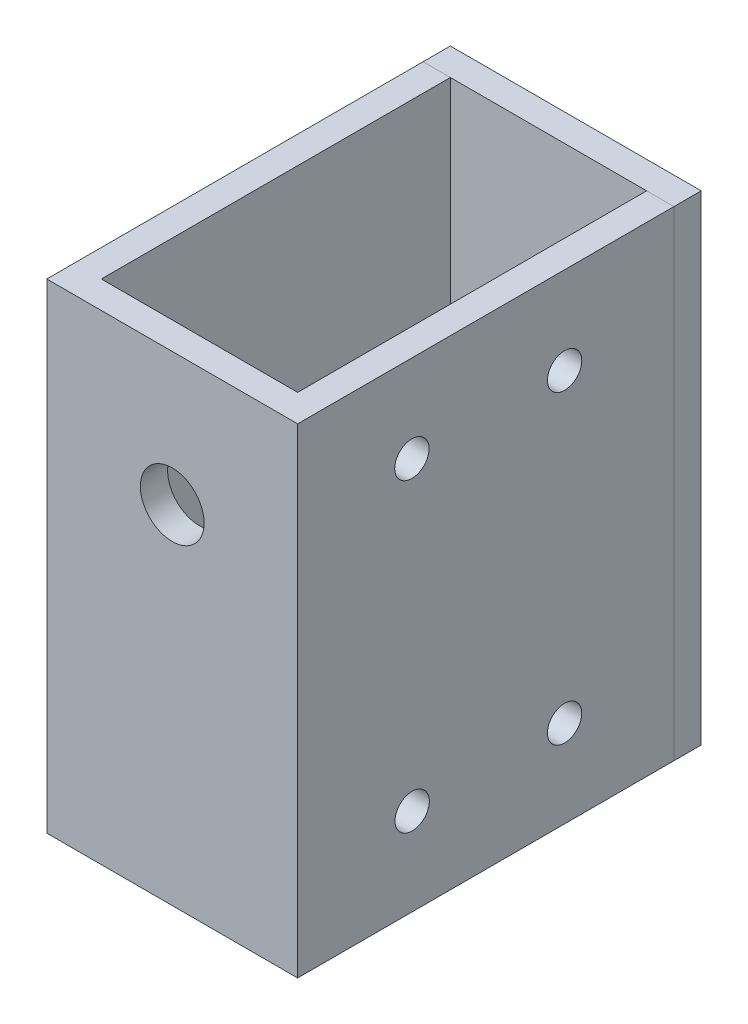
ISO-10303-21;
HEADER;
FILE_DESCRIPTION(('STEP AP214'),'2;1');
FILE_NAME('part.step','',(''),(''),'','','');
FILE_SCHEMA(('AUTOMOTIVE_DESIGN { 1 0 10303 214 1 1 1 1 }'));
ENDSEC;
DATA;
#1=APPLICATION_CONTEXT('core data for automotive mechanical design processes');
#2=APPLICATION_PROTOCOL_DEFINITION('international standard','automotive_design',2000,#1);
#3=PRODUCT_CONTEXT('',#1,'mechanical');
#4=PRODUCT('Part','Part','',(#3));
#5=PRODUCT_RELATED_PRODUCT_CATEGORY('part','',(#4));
#6=PRODUCT_DEFINITION_FORMATION('','',#4);
#7=PRODUCT_DEFINITION_CONTEXT('part definition',#1,'design');
#8=PRODUCT_DEFINITION('design','',#6,#7);
#9=PRODUCT_DEFINITION_SHAPE('','',#8);
#10=(LENGTH_UNIT() NAMED_UNIT(*) SI_UNIT(.MILLI.,.METRE.));
#11=(NAMED_UNIT(*) PLANE_ANGLE_UNIT() SI_UNIT($,.RADIAN.));
#12=(NAMED_UNIT(*) SI_UNIT($,.STERADIAN.) SOLID_ANGLE_UNIT());
#13=UNCERTAINTY_MEASURE_WITH_UNIT(LENGTH_MEASURE(1.E-05),#10,'distance_accuracy_value','');
#14=(GEOMETRIC_REPRESENTATION_CONTEXT(3) GLOBAL_UNCERTAINTY_ASSIGNED_CONTEXT((#13)) GLOBAL_UNIT_ASSIGNED_CONTEXT((#10,
#11,#12)) REPRESENTATION_CONTEXT('',''));
#15=CARTESIAN_POINT('',(0.,0.,0.));
#16=DIRECTION('',(0.,0.,1.));
#17=DIRECTION('',(1.,0.,0.));
#18=AXIS2_PLACEMENT_3D('',#15,#16,#17);
#19=CARTESIAN_POINT('',(0.,55.88,-3.175));
#20=DIRECTION('',(0.,-1.,0.));
#21=DIRECTION('',(0.,0.,-1.));
#22=AXIS2_PLACEMENT_3D('',#19,#20,#21);
#23=PLANE('',#22);
#24=DIRECTION('',(1.,0.,0.));
#25=VECTOR('',#24,1.);
#26=CARTESIAN_POINT('',(0.,55.88,0.));
#27=LINE('',#26,#25);
#28=CARTESIAN_POINT('',(0.,55.88,0.));
#29=VERTEX_POINT('',#28);
#30=CARTESIAN_POINT('',(29.21,55.88,0.));
#31=VERTEX_POINT('',#30);
#32=EDGE_CURVE('E114',#29,#31,#27,.T.);
#33=ORIENTED_EDGE('',*,*,#32,.T.);
#34=DIRECTION('',(0.,0.,1.));
#35=VECTOR('',#34,1.);
#36=CARTESIAN_POINT('',(29.21,55.88,-3.175));
#37=LINE('',#36,#35);
#38=CARTESIAN_POINT('',(29.21,55.88,-3.175));
#39=VERTEX_POINT('',#38);
#40=EDGE_CURVE('E12',#39,#31,#37,.T.);
#41=ORIENTED_EDGE('',*,*,#40,.F.);
#42=DIRECTION('',(1.,0.,0.));
#43=VECTOR('',#42,1.);
#44=CARTESIAN_POINT('',(0.,55.88,-3.175));
#45=LINE('',#44,#43);
#46=CARTESIAN_POINT('',(0.,55.88,-3.175));
#47=VERTEX_POINT('',#46);
#48=EDGE_CURVE('E102',#47,#39,#45,.T.);
#49=ORIENTED_EDGE('',*,*,#48,.F.);
#50=DIRECTION('',(0.,0.,1.));
#51=VECTOR('',#50,1.);
#52=CARTESIAN_POINT('',(0.,55.88,-3.175));
#53=LINE('',#52,#51);
#54=EDGE_CURVE('E110',#47,#29,#53,.T.);
#55=ORIENTED_EDGE('',*,*,#54,.T.);
#56=EDGE_LOOP('',(#33,#41,#49,#55));
#57=FACE_BOUND('',#56,.T.);
#58=ADVANCED_FACE('F51',(#57),#23,.F.);
#59=CARTESIAN_POINT('',(29.21,55.88,-3.175));
#60=DIRECTION('',(-1.,0.,0.));
#61=DIRECTION('',(0.,-1.,0.));
#62=AXIS2_PLACEMENT_3D('',#59,#60,#61);
#63=PLANE('',#62);
#64=DIRECTION('',(0.,-1.,0.));
#65=VECTOR('',#64,1.);
#66=CARTESIAN_POINT('',(29.21,55.88,0.));
#67=LINE('',#66,#65);
#68=CARTESIAN_POINT('',(29.21,0.,0.));
#69=VERTEX_POINT('',#68);
#70=EDGE_CURVE('E106',#31,#69,#67,.T.);
#71=ORIENTED_EDGE('',*,*,#70,.T.);
#72=DIRECTION('',(0.,0.,1.));
#73=VECTOR('',#72,1.);
#74=CARTESIAN_POINT('',(29.21,0.,-3.175));
#75=LINE('',#74,#73);
#76=CARTESIAN_POINT('',(29.21,0.,-3.175));
#77=VERTEX_POINT('',#76);
#78=EDGE_CURVE('E59',#77,#69,#75,.T.);
#79=ORIENTED_EDGE('',*,*,#78,.F.);
#80=DIRECTION('',(0.,-1.,0.));
#81=VECTOR('',#80,1.);
#82=CARTESIAN_POINT('',(29.21,55.88,-3.175));
#83=LINE('',#82,#81);
#84=EDGE_CURVE('E97',#39,#77,#83,.T.);
#85=ORIENTED_EDGE('',*,*,#84,.F.);
#86=ORIENTED_EDGE('',*,*,#40,.T.);
#87=EDGE_LOOP('',(#71,#79,#85,#86));
#88=FACE_BOUND('',#87,.T.);
#89=ADVANCED_FACE('F105',(#88),#63,.F.);
#90=CARTESIAN_POINT('',(29.21,0.,-3.175));
#91=DIRECTION('',(0.,1.,0.));
#92=DIRECTION('',(-1.,0.,0.));
#93=AXIS2_PLACEMENT_3D('',#90,#91,#92);
#94=PLANE('',#93);
#95=DIRECTION('',(-1.,0.,0.));
#96=VECTOR('',#95,1.);
#97=CARTESIAN_POINT('',(29.21,0.,0.));
#98=LINE('',#97,#96);
#99=CARTESIAN_POINT('',(0.,0.,0.));
#100=VERTEX_POINT('',#99);
#101=EDGE_CURVE('E84',#69,#100,#98,.T.);
#102=ORIENTED_EDGE('',*,*,#101,.T.);
#103=DIRECTION('',(0.,0.,1.));
#104=VECTOR('',#103,1.);
#105=CARTESIAN_POINT('',(0.,0.,-3.175));
#106=LINE('',#105,#104);
#107=CARTESIAN_POINT('',(0.,0.,-3.175));
#108=VERTEX_POINT('',#107);
#109=EDGE_CURVE('E107',#108,#100,#106,.T.);
#110=ORIENTED_EDGE('',*,*,#109,.F.);
#111=DIRECTION('',(-1.,0.,0.));
#112=VECTOR('',#111,1.);
#113=CARTESIAN_POINT('',(29.21,0.,-3.175));
#114=LINE('',#113,#112);
#115=EDGE_CURVE('E100',#77,#108,#114,.T.);
#116=ORIENTED_EDGE('',*,*,#115,.F.);
#117=ORIENTED_EDGE('',*,*,#78,.T.);
#118=EDGE_LOOP('',(#102,#110,#116,#117));
#119=FACE_BOUND('',#118,.T.);
#120=ADVANCED_FACE('F108',(#119),#94,.F.);
#121=CARTESIAN_POINT('',(0.,0.,-3.175));
#122=DIRECTION('',(1.,0.,0.));
#123=DIRECTION('',(0.,0.,-1.));
#124=AXIS2_PLACEMENT_3D('',#121,#122,#123);
#125=PLANE('',#124);
#126=DIRECTION('',(0.,1.,0.));
#127=VECTOR('',#126,1.);
#128=CARTESIAN_POINT('',(0.,0.,0.));
#129=LINE('',#128,#127);
#130=EDGE_CURVE('E90',#100,#29,#129,.T.);
#131=ORIENTED_EDGE('',*,*,#130,.T.);
#132=ORIENTED_EDGE('',*,*,#54,.F.);
#133=DIRECTION('',(0.,1.,0.));
#134=VECTOR('',#133,1.);
#135=CARTESIAN_POINT('',(0.,0.,-3.175));
#136=LINE('',#135,#134);
#137=EDGE_CURVE('E67',#108,#47,#136,.T.);
#138=ORIENTED_EDGE('',*,*,#137,.F.);
#139=ORIENTED_EDGE('',*,*,#109,.T.);
#140=EDGE_LOOP('',(#131,#132,#138,#139));
#141=FACE_BOUND('',#140,.T.);
#142=ADVANCED_FACE('F121',(#141),#125,.F.);
#143=CARTESIAN_POINT('',(0.,0.,-3.175));
#144=DIRECTION('',(0.,0.,-1.));
#145=DIRECTION('',(-1.,0.,0.));
#146=AXIS2_PLACEMENT_3D('',#143,#144,#145);
#147=PLANE('',#146);
#148=ORIENTED_EDGE('',*,*,#48,.T.);
#149=ORIENTED_EDGE('',*,*,#84,.T.);
#150=ORIENTED_EDGE('',*,*,#115,.T.);
#151=ORIENTED_EDGE('',*,*,#137,.T.);
#152=EDGE_LOOP('',(#148,#149,#150,#151));
#153=FACE_BOUND('',#152,.T.);
#154=ADVANCED_FACE('F98',(#153),#147,.T.);
#155=CARTESIAN_POINT('',(0.,0.,0.));
#156=DIRECTION('',(0.,0.,-1.));
#157=DIRECTION('',(-1.,0.,0.));
#158=AXIS2_PLACEMENT_3D('',#155,#156,#157);
#159=PLANE('',#158);
#160=ORIENTED_EDGE('',*,*,#32,.F.);
#161=ORIENTED_EDGE('',*,*,#130,.F.);
#162=ORIENTED_EDGE('',*,*,#101,.F.);
#163=ORIENTED_EDGE('',*,*,#70,.F.);
#164=EDGE_LOOP('',(#160,#161,#162,#163));
#165=FACE_BOUND('',#164,.T.);
#166=ADVANCED_FACE('F124',(#165),#159,.F.);
#167=CLOSED_SHELL('',(#58,#89,#120,#142,#154,#166));
#168=MANIFOLD_SOLID_BREP('B2',#167);
#169=CARTESIAN_POINT('',(29.21,0.,40.64));
#170=DIRECTION('',(0.,1.,0.));
#171=DIRECTION('',(-1.,0.,0.));
#172=AXIS2_PLACEMENT_3D('',#169,#170,#171);
#173=PLANE('',#172);
#174=DIRECTION('',(1.,0.,0.));
#175=VECTOR('',#174,1.);
#176=CARTESIAN_POINT('',(29.21,0.,0.));
#177=LINE('',#176,#175);
#178=CARTESIAN_POINT('',(0.,0.,0.));
#179=VERTEX_POINT('',#178);
#180=CARTESIAN_POINT('',(29.21,0.,0.));
#181=VERTEX_POINT('',#180);
#182=EDGE_CURVE('E278',#179,#181,#177,.T.);
#183=ORIENTED_EDGE('',*,*,#182,.T.);
#184=DIRECTION('',(0.,0.,-1.));
#185=VECTOR('',#184,1.);
#186=CARTESIAN_POINT('',(29.21,0.,40.64));
#187=LINE('',#186,#185);
#188=CARTESIAN_POINT('',(29.21,0.,43.815));
#189=VERTEX_POINT('',#188);
#190=EDGE_CURVE('E49',#189,#181,#187,.T.);
#191=ORIENTED_EDGE('',*,*,#190,.F.);
#192=DIRECTION('',(1.,0.,0.));
#193=VECTOR('',#192,1.);
#194=CARTESIAN_POINT('',(0.,0.,43.815));
#195=LINE('',#194,#193);
#196=CARTESIAN_POINT('',(0.,0.,43.815));
#197=VERTEX_POINT('',#196);
#198=EDGE_CURVE('E262',#197,#189,#195,.T.);
#199=ORIENTED_EDGE('',*,*,#198,.F.);
#200=DIRECTION('',(0.,0.,-1.));
#201=VECTOR('',#200,1.);
#202=CARTESIAN_POINT('',(0.,0.,40.64));
#203=LINE('',#202,#201);
#204=EDGE_CURVE('E254',#197,#179,#203,.T.);
#205=ORIENTED_EDGE('',*,*,#204,.T.);
#206=EDGE_LOOP('',(#183,#191,#199,#205));
#207=FACE_BOUND('',#206,.T.);
#208=ADVANCED_FACE('F175',(#207),#173,.F.);
#209=CARTESIAN_POINT('',(29.21,55.88,40.64));
#210=DIRECTION('',(-1.,0.,0.));
#211=DIRECTION('',(0.,-1.,0.));
#212=AXIS2_PLACEMENT_3D('',#209,#210,#211);
#213=PLANE('',#212);
#214=CARTESIAN_POINT('',(29.21,45.72,30.5127030555497));
#215=DIRECTION('',(1.,0.,0.));
#216=DIRECTION('',(0.,1.,0.));
#217=AXIS2_PLACEMENT_3D('',#214,#215,#216);
#218=CIRCLE('',#217,2.);
#219=CARTESIAN_POINT('',(29.21,47.72,30.5127030555497));
#220=VERTEX_POINT('',#219);
#221=EDGE_CURVE('E395',#220,#220,#218,.T.);
#222=ORIENTED_EDGE('',*,*,#221,.F.);
#223=EDGE_LOOP('',(#222));
#224=FACE_BOUND('',#223,.T.);
#225=CARTESIAN_POINT('',(29.21,10.16,30.48));
#226=DIRECTION('',(1.,0.,0.));
#227=DIRECTION('',(0.,1.,0.));
#228=AXIS2_PLACEMENT_3D('',#225,#226,#227);
#229=CIRCLE('',#228,2.);
#230=CARTESIAN_POINT('',(29.21,12.16,30.48));
#231=VERTEX_POINT('',#230);
#232=EDGE_CURVE('E387',#231,#231,#229,.T.);
#233=ORIENTED_EDGE('',*,*,#232,.F.);
#234=EDGE_LOOP('',(#233));
#235=FACE_BOUND('',#234,.T.);
#236=CARTESIAN_POINT('',(29.21,10.16,12.7327030555497));
#237=DIRECTION('',(1.,0.,0.));
#238=DIRECTION('',(0.,1.,0.));
#239=AXIS2_PLACEMENT_3D('',#236,#237,#238);
#240=CIRCLE('',#239,2.);
#241=CARTESIAN_POINT('',(29.21,12.16,12.7327030555497));
#242=VERTEX_POINT('',#241);
#243=EDGE_CURVE('E380',#242,#242,#240,.T.);
#244=ORIENTED_EDGE('',*,*,#243,.F.);
#245=EDGE_LOOP('',(#244));
#246=FACE_BOUND('',#245,.T.);
#247=CARTESIAN_POINT('',(29.21,45.72,12.7327030555497));
#248=DIRECTION('',(1.,0.,0.));
#249=DIRECTION('',(0.,1.,0.));
#250=AXIS2_PLACEMENT_3D('',#247,#248,#249);
#251=CIRCLE('',#250,2.);
#252=CARTESIAN_POINT('',(29.21,47.72,12.7327030555497));
#253=VERTEX_POINT('',#252);
#254=EDGE_CURVE('E382',#253,#253,#251,.T.);
#255=ORIENTED_EDGE('',*,*,#254,.F.);
#256=EDGE_LOOP('',(#255));
#257=FACE_BOUND('',#256,.T.);
#258=DIRECTION('',(0.,1.,0.));
#259=VECTOR('',#258,1.);
#260=CARTESIAN_POINT('',(29.21,55.88,0.));
#261=LINE('',#260,#259);
#262=CARTESIAN_POINT('',(29.21,55.88,0.));
#263=VERTEX_POINT('',#262);
#264=EDGE_CURVE('E291',#181,#263,#261,.T.);
#265=ORIENTED_EDGE('',*,*,#264,.T.);
#266=DIRECTION('',(0.,0.,-1.));
#267=VECTOR('',#266,1.);
#268=CARTESIAN_POINT('',(29.21,55.88,40.64));
#269=LINE('',#268,#267);
#270=CARTESIAN_POINT('',(29.21,55.88,43.815));
#271=VERTEX_POINT('',#270);
#272=EDGE_CURVE('E183',#271,#263,#269,.T.);
#273=ORIENTED_EDGE('',*,*,#272,.F.);
#274=DIRECTION('',(0.,1.,0.));
#275=VECTOR('',#274,1.);
#276=CARTESIAN_POINT('',(29.21,0.,43.815));
#277=LINE('',#276,#275);
#278=EDGE_CURVE('E268',#189,#271,#277,.T.);
#279=ORIENTED_EDGE('',*,*,#278,.F.);
#280=ORIENTED_EDGE('',*,*,#190,.T.);
#281=EDGE_LOOP('',(#265,#273,#279,#280));
#282=FACE_BOUND('',#281,.T.);
#283=ADVANCED_FACE('F325',(#224,#235,#246,#257,#282),#213,.F.);
#284=CARTESIAN_POINT('',(26.035,3.175,40.64));
#285=DIRECTION('',(1.,0.,0.));
#286=DIRECTION('',(0.,0.,-1.));
#287=AXIS2_PLACEMENT_3D('',#284,#285,#286);
#288=PLANE('',#287);
#289=CARTESIAN_POINT('',(26.035,45.72,30.5127030555497));
#290=DIRECTION('',(1.,0.,0.));
#291=DIRECTION('',(0.,1.,0.));
#292=AXIS2_PLACEMENT_3D('',#289,#290,#291);
#293=CIRCLE('',#292,2.);
#294=CARTESIAN_POINT('',(26.035,47.72,30.5127030555497));
#295=VERTEX_POINT('',#294);
#296=EDGE_CURVE('E398',#295,#295,#293,.T.);
#297=ORIENTED_EDGE('',*,*,#296,.T.);
#298=EDGE_LOOP('',(#297));
#299=FACE_BOUND('',#298,.T.);
#300=CARTESIAN_POINT('',(26.035,10.16,30.48));
#301=DIRECTION('',(1.,0.,0.));
#302=DIRECTION('',(0.,1.,0.));
#303=AXIS2_PLACEMENT_3D('',#300,#301,#302);
#304=CIRCLE('',#303,2.);
#305=CARTESIAN_POINT('',(26.035,12.16,30.48));
#306=VERTEX_POINT('',#305);
#307=EDGE_CURVE('E392',#306,#306,#304,.T.);
#308=ORIENTED_EDGE('',*,*,#307,.T.);
#309=EDGE_LOOP('',(#308));
#310=FACE_BOUND('',#309,.T.);
#311=CARTESIAN_POINT('',(26.035,10.16,12.7327030555497));
#312=DIRECTION('',(1.,0.,0.));
#313=DIRECTION('',(0.,1.,0.));
#314=AXIS2_PLACEMENT_3D('',#311,#312,#313);
#315=CIRCLE('',#314,2.);
#316=CARTESIAN_POINT('',(26.035,12.16,12.7327030555497));
#317=VERTEX_POINT('',#316);
#318=EDGE_CURVE('E377',#317,#317,#315,.T.);
#319=ORIENTED_EDGE('',*,*,#318,.T.);
#320=EDGE_LOOP('',(#319));
#321=FACE_BOUND('',#320,.T.);
#322=CARTESIAN_POINT('',(26.035,45.72,12.7327030555497));
#323=DIRECTION('',(1.,0.,0.));
#324=DIRECTION('',(0.,1.,0.));
#325=AXIS2_PLACEMENT_3D('',#322,#323,#324);
#326=CIRCLE('',#325,2.);
#327=CARTESIAN_POINT('',(26.035,47.72,12.7327030555497));
#328=VERTEX_POINT('',#327);
#329=EDGE_CURVE('E385',#328,#328,#326,.T.);
#330=ORIENTED_EDGE('',*,*,#329,.T.);
#331=EDGE_LOOP('',(#330));
#332=FACE_BOUND('',#331,.T.);
#333=DIRECTION('',(0.,-1.,0.));
#334=VECTOR('',#333,1.);
#335=CARTESIAN_POINT('',(26.035,3.175,0.));
#336=LINE('',#335,#334);
#337=CARTESIAN_POINT('',(26.035,55.88,0.));
#338=VERTEX_POINT('',#337);
#339=CARTESIAN_POINT('',(26.035,3.175,0.));
#340=VERTEX_POINT('',#339);
#341=EDGE_CURVE('E295',#338,#340,#336,.T.);
#342=ORIENTED_EDGE('',*,*,#341,.T.);
#343=DIRECTION('',(0.,0.,-1.));
#344=VECTOR('',#343,1.);
#345=CARTESIAN_POINT('',(26.035,3.175,40.64));
#346=LINE('',#345,#344);
#347=CARTESIAN_POINT('',(26.035,3.175,40.64));
#348=VERTEX_POINT('',#347);
#349=EDGE_CURVE('E306',#348,#340,#346,.T.);
#350=ORIENTED_EDGE('',*,*,#349,.F.);
#351=DIRECTION('',(0.,-1.,0.));
#352=VECTOR('',#351,1.);
#353=CARTESIAN_POINT('',(26.035,3.175,40.64));
#354=LINE('',#353,#352);
#355=CARTESIAN_POINT('',(26.035,55.88,40.64));
#356=VERTEX_POINT('',#355);
#357=EDGE_CURVE('E280',#356,#348,#354,.T.);
#358=ORIENTED_EDGE('',*,*,#357,.F.);
#359=DIRECTION('',(0.,0.,-1.));
#360=VECTOR('',#359,1.);
#361=CARTESIAN_POINT('',(26.035,55.88,40.64));
#362=LINE('',#361,#360);
#363=EDGE_CURVE('E232',#356,#338,#362,.T.);
#364=ORIENTED_EDGE('',*,*,#363,.T.);
#365=EDGE_LOOP('',(#342,#350,#358,#364));
#366=FACE_BOUND('',#365,.T.);
#367=ADVANCED_FACE('F318',(#299,#310,#321,#332,#366),#288,.F.);
#368=CARTESIAN_POINT('',(3.17500000000001,3.175,40.64));
#369=DIRECTION('',(0.,-1.,0.));
#370=DIRECTION('',(0.,0.,-1.));
#371=AXIS2_PLACEMENT_3D('',#368,#369,#370);
#372=PLANE('',#371);
#373=DIRECTION('',(-1.,0.,0.));
#374=VECTOR('',#373,1.);
#375=CARTESIAN_POINT('',(3.17500000000001,3.175,0.));
#376=LINE('',#375,#374);
#377=CARTESIAN_POINT('',(3.17500000000001,3.175,0.));
#378=VERTEX_POINT('',#377);
#379=EDGE_CURVE('E297',#340,#378,#376,.T.);
#380=ORIENTED_EDGE('',*,*,#379,.T.);
#381=DIRECTION('',(0.,0.,-1.));
#382=VECTOR('',#381,1.);
#383=CARTESIAN_POINT('',(3.17500000000001,3.175,40.64));
#384=LINE('',#383,#382);
#385=CARTESIAN_POINT('',(3.17500000000001,3.175,40.64));
#386=VERTEX_POINT('',#385);
#387=EDGE_CURVE('E191',#386,#378,#384,.T.);
#388=ORIENTED_EDGE('',*,*,#387,.F.);
#389=DIRECTION('',(-1.,0.,0.));
#390=VECTOR('',#389,1.);
#391=CARTESIAN_POINT('',(3.17500000000001,3.175,40.64));
#392=LINE('',#391,#390);
#393=EDGE_CURVE('E283',#348,#386,#392,.T.);
#394=ORIENTED_EDGE('',*,*,#393,.F.);
#395=ORIENTED_EDGE('',*,*,#349,.T.);
#396=EDGE_LOOP('',(#380,#388,#394,#395));
#397=FACE_BOUND('',#396,.T.);
#398=ADVANCED_FACE('F319',(#397),#372,.F.);
#399=CARTESIAN_POINT('',(3.175,55.88,40.64));
#400=DIRECTION('',(-1.,0.,0.));
#401=DIRECTION('',(0.,-1.,0.));
#402=AXIS2_PLACEMENT_3D('',#399,#400,#401);
#403=PLANE('',#402);
#404=DIRECTION('',(0.,1.,0.));
#405=VECTOR('',#404,1.);
#406=CARTESIAN_POINT('',(3.175,55.88,0.));
#407=LINE('',#406,#405);
#408=CARTESIAN_POINT('',(3.175,55.88,0.));
#409=VERTEX_POINT('',#408);
#410=EDGE_CURVE('E299',#378,#409,#407,.T.);
#411=ORIENTED_EDGE('',*,*,#410,.T.);
#412=DIRECTION('',(0.,0.,-1.));
#413=VECTOR('',#412,1.);
#414=CARTESIAN_POINT('',(3.175,55.88,40.64));
#415=LINE('',#414,#413);
#416=CARTESIAN_POINT('',(3.175,55.88,40.64));
#417=VERTEX_POINT('',#416);
#418=EDGE_CURVE('E253',#417,#409,#415,.T.);
#419=ORIENTED_EDGE('',*,*,#418,.F.);
#420=DIRECTION('',(0.,1.,0.));
#421=VECTOR('',#420,1.);
#422=CARTESIAN_POINT('',(3.175,55.88,40.64));
#423=LINE('',#422,#421);
#424=EDGE_CURVE('E286',#386,#417,#423,.T.);
#425=ORIENTED_EDGE('',*,*,#424,.F.);
#426=ORIENTED_EDGE('',*,*,#387,.T.);
#427=EDGE_LOOP('',(#411,#419,#425,#426));
#428=FACE_BOUND('',#427,.T.);
#429=ADVANCED_FACE('F340',(#428),#403,.F.);
#430=CARTESIAN_POINT('',(0.,55.88,40.64));
#431=DIRECTION('',(0.,-1.,0.));
#432=DIRECTION('',(0.,0.,-1.));
#433=AXIS2_PLACEMENT_3D('',#430,#431,#432);
#434=PLANE('',#433);
#435=DIRECTION('',(-1.,0.,0.));
#436=VECTOR('',#435,1.);
#437=CARTESIAN_POINT('',(0.,55.88,0.));
#438=LINE('',#437,#436);
#439=CARTESIAN_POINT('',(0.,55.88,0.));
#440=VERTEX_POINT('',#439);
#441=EDGE_CURVE('E221',#409,#440,#438,.T.);
#442=ORIENTED_EDGE('',*,*,#441,.T.);
#443=DIRECTION('',(0.,0.,-1.));
#444=VECTOR('',#443,1.);
#445=CARTESIAN_POINT('',(0.,55.88,40.64));
#446=LINE('',#445,#444);
#447=CARTESIAN_POINT('',(0.,55.88,43.815));
#448=VERTEX_POINT('',#447);
#449=EDGE_CURVE('E247',#448,#440,#446,.T.);
#450=ORIENTED_EDGE('',*,*,#449,.F.);
#451=DIRECTION('',(-1.,0.,0.));
#452=VECTOR('',#451,1.);
#453=CARTESIAN_POINT('',(29.21,55.88,43.815));
#454=LINE('',#453,#452);
#455=EDGE_CURVE('E252',#271,#448,#454,.T.);
#456=ORIENTED_EDGE('',*,*,#455,.F.);
#457=ORIENTED_EDGE('',*,*,#272,.T.);
#458=DIRECTION('',(-1.,0.,0.));
#459=VECTOR('',#458,1.);
#460=CARTESIAN_POINT('',(26.035,55.88,0.));
#461=LINE('',#460,#459);
#462=EDGE_CURVE('E293',#263,#338,#461,.T.);
#463=ORIENTED_EDGE('',*,*,#462,.T.);
#464=ORIENTED_EDGE('',*,*,#363,.F.);
#465=DIRECTION('',(-1.,0.,0.));
#466=VECTOR('',#465,1.);
#467=CARTESIAN_POINT('',(29.21,55.88,40.64));
#468=LINE('',#467,#466);
#469=EDGE_CURVE('E269',#356,#417,#468,.T.);
#470=ORIENTED_EDGE('',*,*,#469,.T.);
#471=ORIENTED_EDGE('',*,*,#418,.T.);
#472=EDGE_LOOP('',(#442,#450,#456,#457,#463,#464,#470,#471));
#473=FACE_BOUND('',#472,.T.);
#474=ADVANCED_FACE('F249',(#473),#434,.F.);
#475=CARTESIAN_POINT('',(0.,0.,40.64));
#476=DIRECTION('',(1.,0.,0.));
#477=DIRECTION('',(0.,0.,-1.));
#478=AXIS2_PLACEMENT_3D('',#475,#476,#477);
#479=PLANE('',#478);
#480=DIRECTION('',(0.,-1.,0.));
#481=VECTOR('',#480,1.);
#482=CARTESIAN_POINT('',(0.,0.,0.));
#483=LINE('',#482,#481);
#484=EDGE_CURVE('E227',#440,#179,#483,.T.);
#485=ORIENTED_EDGE('',*,*,#484,.T.);
#486=ORIENTED_EDGE('',*,*,#204,.F.);
#487=DIRECTION('',(0.,-1.,0.));
#488=VECTOR('',#487,1.);
#489=CARTESIAN_POINT('',(0.,55.88,43.815));
#490=LINE('',#489,#488);
#491=EDGE_CURVE('E257',#448,#197,#490,.T.);
#492=ORIENTED_EDGE('',*,*,#491,.F.);
#493=ORIENTED_EDGE('',*,*,#449,.T.);
#494=EDGE_LOOP('',(#485,#486,#492,#493));
#495=FACE_BOUND('',#494,.T.);
#496=ADVANCED_FACE('F258',(#495),#479,.F.);
#497=CARTESIAN_POINT('',(0.,0.,0.));
#498=DIRECTION('',(0.,0.,-1.));
#499=DIRECTION('',(-1.,0.,0.));
#500=AXIS2_PLACEMENT_3D('',#497,#498,#499);
#501=PLANE('',#500);
#502=ORIENTED_EDGE('',*,*,#182,.F.);
#503=ORIENTED_EDGE('',*,*,#484,.F.);
#504=ORIENTED_EDGE('',*,*,#441,.F.);
#505=ORIENTED_EDGE('',*,*,#410,.F.);
#506=ORIENTED_EDGE('',*,*,#379,.F.);
#507=ORIENTED_EDGE('',*,*,#341,.F.);
#508=ORIENTED_EDGE('',*,*,#462,.F.);
#509=ORIENTED_EDGE('',*,*,#264,.F.);
#510=EDGE_LOOP('',(#502,#503,#504,#505,#506,#507,#508,#509));
#511=FACE_BOUND('',#510,.T.);
#512=ADVANCED_FACE('F314',(#511),#501,.T.);
#513=CARTESIAN_POINT('',(0.,0.,40.64));
#514=DIRECTION('',(0.,0.,1.));
#515=DIRECTION('',(1.,0.,0.));
#516=AXIS2_PLACEMENT_3D('',#513,#514,#515);
#517=PLANE('',#516);
#518=CARTESIAN_POINT('',(14.605,40.4262889338127,40.64));
#519=DIRECTION('',(0.,0.,1.));
#520=DIRECTION('',(1.,0.,0.));
#521=AXIS2_PLACEMENT_3D('',#518,#519,#520);
#522=CIRCLE('',#521,3.71244059377879);
#523=CARTESIAN_POINT('',(18.3174405937788,40.4262889338127,40.64));
#524=VERTEX_POINT('',#523);
#525=EDGE_CURVE('E274',#524,#524,#522,.T.);
#526=ORIENTED_EDGE('',*,*,#525,.T.);
#527=EDGE_LOOP('',(#526));
#528=FACE_BOUND('',#527,.T.);
#529=ORIENTED_EDGE('',*,*,#469,.F.);
#530=ORIENTED_EDGE('',*,*,#357,.T.);
#531=ORIENTED_EDGE('',*,*,#393,.T.);
#532=ORIENTED_EDGE('',*,*,#424,.T.);
#533=EDGE_LOOP('',(#529,#530,#531,#532));
#534=FACE_BOUND('',#533,.T.);
#535=ADVANCED_FACE('F322',(#528,#534),#517,.F.);
#536=CARTESIAN_POINT('',(0.,0.,43.815));
#537=DIRECTION('',(0.,0.,1.));
#538=DIRECTION('',(1.,0.,0.));
#539=AXIS2_PLACEMENT_3D('',#536,#537,#538);
#540=PLANE('',#539);
#541=ORIENTED_EDGE('',*,*,#455,.T.);
#542=ORIENTED_EDGE('',*,*,#491,.T.);
#543=ORIENTED_EDGE('',*,*,#198,.T.);
#544=ORIENTED_EDGE('',*,*,#278,.T.);
#545=EDGE_LOOP('',(#541,#542,#543,#544));
#546=FACE_BOUND('',#545,.T.);
#547=CARTESIAN_POINT('',(14.605,40.4262889338127,43.815));
#548=DIRECTION('',(0.,0.,1.));
#549=DIRECTION('',(1.,0.,0.));
#550=AXIS2_PLACEMENT_3D('',#547,#548,#549);
#551=CIRCLE('',#550,3.71244059377879);
#552=CARTESIAN_POINT('',(18.3174405937788,40.4262889338127,43.815));
#553=VERTEX_POINT('',#552);
#554=EDGE_CURVE('E271',#553,#553,#551,.T.);
#555=ORIENTED_EDGE('',*,*,#554,.F.);
#556=EDGE_LOOP('',(#555));
#557=FACE_BOUND('',#556,.T.);
#558=ADVANCED_FACE('F265',(#546,#557),#540,.T.);
#559=CARTESIAN_POINT('',(14.605,40.4262889338127,43.815));
#560=DIRECTION('',(0.,0.,-1.));
#561=DIRECTION('',(-1.,0.,0.));
#562=AXIS2_PLACEMENT_3D('',#559,#560,#561);
#563=CYLINDRICAL_SURFACE('',#562,3.71244059377879);
#564=ORIENTED_EDGE('',*,*,#554,.T.);
#565=EDGE_LOOP('',(#564));
#566=FACE_BOUND('',#565,.T.);
#567=ORIENTED_EDGE('',*,*,#525,.F.);
#568=EDGE_LOOP('',(#567));
#569=FACE_BOUND('',#568,.T.);
#570=ADVANCED_FACE('F354',(#566,#569),#563,.F.);
#571=CARTESIAN_POINT('',(26.035,45.72,12.7327030555497));
#572=DIRECTION('',(1.,0.,0.));
#573=DIRECTION('',(0.,1.,0.));
#574=AXIS2_PLACEMENT_3D('',#571,#572,#573);
#575=CYLINDRICAL_SURFACE('',#574,2.);
#576=ORIENTED_EDGE('',*,*,#329,.F.);
#577=EDGE_LOOP('',(#576));
#578=FACE_BOUND('',#577,.T.);
#579=ORIENTED_EDGE('',*,*,#254,.T.);
#580=EDGE_LOOP('',(#579));
#581=FACE_BOUND('',#580,.T.);
#582=ADVANCED_FACE('F356',(#578,#581),#575,.F.);
#583=CARTESIAN_POINT('',(26.035,10.16,12.7327030555497));
#584=DIRECTION('',(1.,0.,0.));
#585=DIRECTION('',(0.,1.,0.));
#586=AXIS2_PLACEMENT_3D('',#583,#584,#585);
#587=CYLINDRICAL_SURFACE('',#586,2.);
#588=ORIENTED_EDGE('',*,*,#318,.F.);
#589=EDGE_LOOP('',(#588));
#590=FACE_BOUND('',#589,.T.);
#591=ORIENTED_EDGE('',*,*,#243,.T.);
#592=EDGE_LOOP('',(#591));
#593=FACE_BOUND('',#592,.T.);
#594=ADVANCED_FACE('F360',(#590,#593),#587,.F.);
#595=CARTESIAN_POINT('',(26.035,10.16,30.48));
#596=DIRECTION('',(1.,0.,0.));
#597=DIRECTION('',(0.,1.,0.));
#598=AXIS2_PLACEMENT_3D('',#595,#596,#597);
#599=CYLINDRICAL_SURFACE('',#598,2.);
#600=ORIENTED_EDGE('',*,*,#307,.F.);
#601=EDGE_LOOP('',(#600));
#602=FACE_BOUND('',#601,.T.);
#603=ORIENTED_EDGE('',*,*,#232,.T.);
#604=EDGE_LOOP('',(#603));
#605=FACE_BOUND('',#604,.T.);
#606=ADVANCED_FACE('F365',(#602,#605),#599,.F.);
#607=CARTESIAN_POINT('',(26.035,45.72,30.5127030555497));
#608=DIRECTION('',(1.,0.,0.));
#609=DIRECTION('',(0.,1.,0.));
#610=AXIS2_PLACEMENT_3D('',#607,#608,#609);
#611=CYLINDRICAL_SURFACE('',#610,2.);
#612=ORIENTED_EDGE('',*,*,#296,.F.);
#613=EDGE_LOOP('',(#612));
#614=FACE_BOUND('',#613,.T.);
#615=ORIENTED_EDGE('',*,*,#221,.T.);
#616=EDGE_LOOP('',(#615));
#617=FACE_BOUND('',#616,.T.);
#618=ADVANCED_FACE('F362',(#614,#617),#611,.F.);
#619=CLOSED_SHELL('',(#208,#283,#367,#398,#429,#474,#496,#512,#535,#558,#570,#582,#594,#606,#618));
#620=MANIFOLD_SOLID_BREP('B6',#619);
#621=ADVANCED_BREP_SHAPE_REPRESENTATION('',(#18,#168,#620),#14);
#622=SHAPE_DEFINITION_REPRESENTATION(#9,#621);
ENDSEC;
END-ISO-10303-21;
